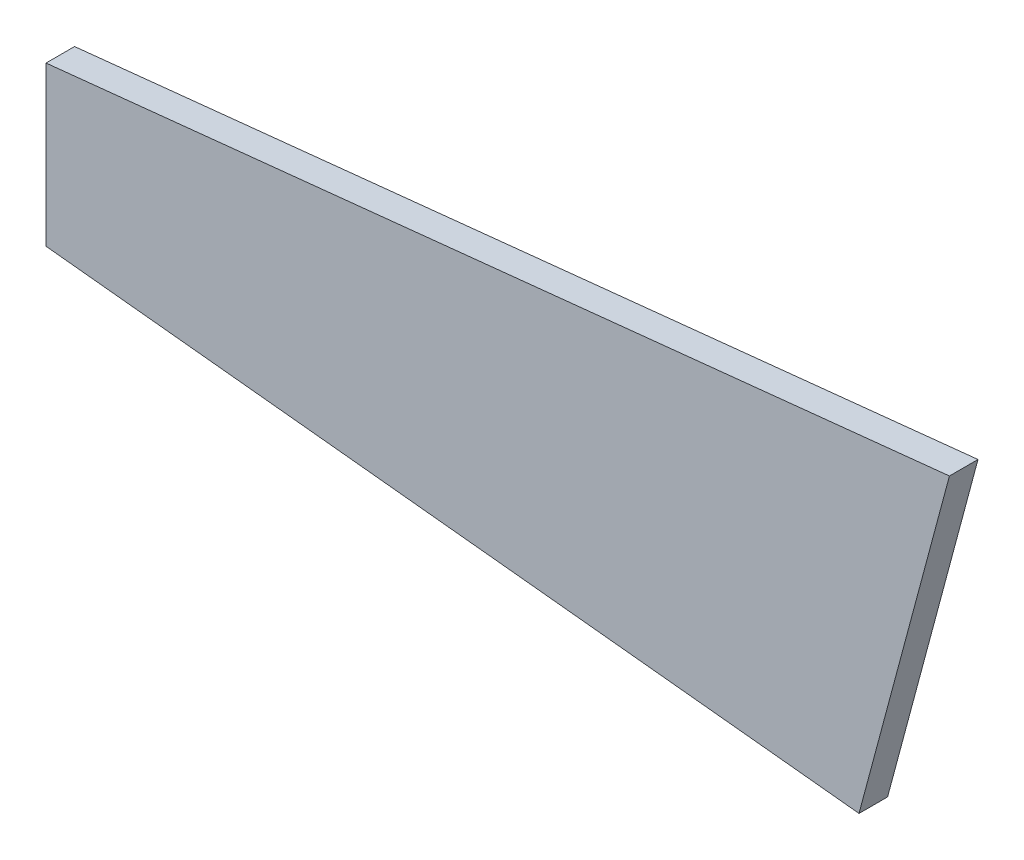
ISO-10303-21;
HEADER;
FILE_DESCRIPTION(('STEP AP214'),'2;1');
FILE_NAME('part.step','',(''),(''),'','','');
FILE_SCHEMA(('AUTOMOTIVE_DESIGN { 1 0 10303 214 1 1 1 1 }'));
ENDSEC;
DATA;
#1=APPLICATION_CONTEXT('core data for automotive mechanical design processes');
#2=APPLICATION_PROTOCOL_DEFINITION('international standard','automotive_design',2000,#1);
#3=PRODUCT_CONTEXT('',#1,'mechanical');
#4=PRODUCT('Part','Part','',(#3));
#5=PRODUCT_RELATED_PRODUCT_CATEGORY('part','',(#4));
#6=PRODUCT_DEFINITION_FORMATION('','',#4);
#7=PRODUCT_DEFINITION_CONTEXT('part definition',#1,'design');
#8=PRODUCT_DEFINITION('design','',#6,#7);
#9=PRODUCT_DEFINITION_SHAPE('','',#8);
#10=(LENGTH_UNIT() NAMED_UNIT(*) SI_UNIT(.MILLI.,.METRE.));
#11=(NAMED_UNIT(*) PLANE_ANGLE_UNIT() SI_UNIT($,.RADIAN.));
#12=(NAMED_UNIT(*) SI_UNIT($,.STERADIAN.) SOLID_ANGLE_UNIT());
#13=UNCERTAINTY_MEASURE_WITH_UNIT(LENGTH_MEASURE(1.E-05),#10,'distance_accuracy_value','');
#14=(GEOMETRIC_REPRESENTATION_CONTEXT(3) GLOBAL_UNCERTAINTY_ASSIGNED_CONTEXT((#13)) GLOBAL_UNIT_ASSIGNED_CONTEXT((#10,
#11,#12)) REPRESENTATION_CONTEXT('',''));
#15=CARTESIAN_POINT('',(0.,0.,0.));
#16=DIRECTION('',(0.,0.,1.));
#17=DIRECTION('',(1.,0.,0.));
#18=AXIS2_PLACEMENT_3D('',#15,#16,#17);
#19=CARTESIAN_POINT('',(140.,50.,-2.273736754432E-13));
#20=DIRECTION('',(0.103606084258982,-0.994618408890827,0.));
#21=DIRECTION('',(0.,0.,-1.));
#22=AXIS2_PLACEMENT_3D('',#19,#20,#21);
#23=PLANE('',#22);
#24=DIRECTION('',(0.,0.,1.));
#25=VECTOR('',#24,1.);
#26=CARTESIAN_POINT('',(-180.,16.666666666667,-2.273736754432E-13));
#27=LINE('',#26,#25);
#28=CARTESIAN_POINT('',(-180.,16.666666666667,-2.273736754432E-13));
#29=VERTEX_POINT('',#28);
#30=CARTESIAN_POINT('',(-180.,16.666666666667,6.));
#31=VERTEX_POINT('',#30);
#32=EDGE_CURVE('E11',#29,#31,#27,.T.);
#33=ORIENTED_EDGE('',*,*,#32,.T.);
#34=DIRECTION('',(-0.994618408890827,-0.103606084258982,0.));
#35=VECTOR('',#34,1.);
#36=CARTESIAN_POINT('',(140.,50.,6.));
#37=LINE('',#36,#35);
#38=CARTESIAN_POINT('',(9.762347773835,36.433577893108,6.));
#39=VERTEX_POINT('',#38);
#40=EDGE_CURVE('E21',#39,#31,#37,.T.);
#41=ORIENTED_EDGE('',*,*,#40,.F.);
#42=DIRECTION('',(0.,0.,-1.));
#43=VECTOR('',#42,1.);
#44=CARTESIAN_POINT('',(9.762347773835,36.433577893108,-917.5));
#45=LINE('',#44,#43);
#46=CARTESIAN_POINT('',(9.762347773835,36.433577893108,-2.273736754432E-13));
#47=VERTEX_POINT('',#46);
#48=EDGE_CURVE('E106',#39,#47,#45,.T.);
#49=ORIENTED_EDGE('',*,*,#48,.T.);
#50=DIRECTION('',(-0.994618408890827,-0.103606084258982,0.));
#51=VECTOR('',#50,1.);
#52=CARTESIAN_POINT('',(140.,50.,-2.273736754432E-13));
#53=LINE('',#52,#51);
#54=EDGE_CURVE('E76',#47,#29,#53,.T.);
#55=ORIENTED_EDGE('',*,*,#54,.T.);
#56=EDGE_LOOP('',(#33,#41,#49,#55));
#57=FACE_BOUND('',#56,.T.);
#58=ADVANCED_FACE('F17',(#57),#23,.F.);
#59=CARTESIAN_POINT('',(-180.,16.666666666667,-2.273736754432E-13));
#60=DIRECTION('',(1.,0.,0.));
#61=DIRECTION('',(0.,1.,0.));
#62=AXIS2_PLACEMENT_3D('',#59,#60,#61);
#63=PLANE('',#62);
#64=DIRECTION('',(0.,-1.,0.));
#65=VECTOR('',#64,1.);
#66=CARTESIAN_POINT('',(-180.,16.666666666667,-2.273736754432E-13));
#67=LINE('',#66,#65);
#68=CARTESIAN_POINT('',(-180.,-16.66666666666,-2.273736754432E-13));
#69=VERTEX_POINT('',#68);
#70=EDGE_CURVE('E81',#29,#69,#67,.T.);
#71=ORIENTED_EDGE('',*,*,#70,.T.);
#72=DIRECTION('',(0.,0.,1.));
#73=VECTOR('',#72,1.);
#74=CARTESIAN_POINT('',(-180.,-16.66666666666,-2.273736754432E-13));
#75=LINE('',#74,#73);
#76=CARTESIAN_POINT('',(-180.,-16.66666666666,6.));
#77=VERTEX_POINT('',#76);
#78=EDGE_CURVE('E89',#69,#77,#75,.T.);
#79=ORIENTED_EDGE('',*,*,#78,.T.);
#80=DIRECTION('',(0.,-1.,0.));
#81=VECTOR('',#80,1.);
#82=CARTESIAN_POINT('',(-180.,16.666666666667,6.));
#83=LINE('',#82,#81);
#84=EDGE_CURVE('E112',#31,#77,#83,.T.);
#85=ORIENTED_EDGE('',*,*,#84,.F.);
#86=ORIENTED_EDGE('',*,*,#32,.F.);
#87=EDGE_LOOP('',(#71,#79,#85,#86));
#88=FACE_BOUND('',#87,.T.);
#89=ADVANCED_FACE('F19',(#88),#63,.F.);
#90=CARTESIAN_POINT('',(-6.268384370371,2.273736754432E-13,6.));
#91=DIRECTION('',(0.,0.,1.));
#92=DIRECTION('',(0.,-1.,0.));
#93=AXIS2_PLACEMENT_3D('',#90,#91,#92);
#94=PLANE('',#93);
#95=ORIENTED_EDGE('',*,*,#84,.T.);
#96=DIRECTION('',(0.994618408890827,-0.103606084258982,0.));
#97=VECTOR('',#96,1.);
#98=CARTESIAN_POINT('',(-180.,-16.66666666666,6.));
#99=LINE('',#98,#97);
#100=CARTESIAN_POINT('',(-9.23218428166,-34.45498080399,6.));
#101=VERTEX_POINT('',#100);
#102=EDGE_CURVE('E96',#77,#101,#99,.T.);
#103=ORIENTED_EDGE('',*,*,#102,.T.);
#104=DIRECTION('',(-0.258819045102985,-0.965925826288944,0.));
#105=VECTOR('',#104,1.);
#106=CARTESIAN_POINT('',(-165.1611633462,-616.3898530453,6.));
#107=LINE('',#106,#105);
#108=EDGE_CURVE('E93',#39,#101,#107,.T.);
#109=ORIENTED_EDGE('',*,*,#108,.F.);
#110=ORIENTED_EDGE('',*,*,#40,.T.);
#111=EDGE_LOOP('',(#95,#103,#109,#110));
#112=FACE_BOUND('',#111,.T.);
#113=ADVANCED_FACE('F120',(#112),#94,.T.);
#114=CARTESIAN_POINT('',(-329.90242456,-1231.212609998,-1835.));
#115=DIRECTION('',(-0.965925826288944,0.258819045102985,0.));
#116=DIRECTION('',(0.,0.,1.));
#117=AXIS2_PLACEMENT_3D('',#114,#115,#116);
#118=PLANE('',#117);
#119=ORIENTED_EDGE('',*,*,#48,.F.);
#120=ORIENTED_EDGE('',*,*,#108,.T.);
#121=DIRECTION('',(0.,0.,1.));
#122=VECTOR('',#121,1.);
#123=CARTESIAN_POINT('',(-9.23218428166,-34.45498080399,-917.5));
#124=LINE('',#123,#122);
#125=CARTESIAN_POINT('',(-9.23218428166,-34.45498080399,-2.273736754432E-13));
#126=VERTEX_POINT('',#125);
#127=EDGE_CURVE('E87',#126,#101,#124,.T.);
#128=ORIENTED_EDGE('',*,*,#127,.F.);
#129=DIRECTION('',(-0.258819045102985,-0.965925826288944,0.));
#130=VECTOR('',#129,1.);
#131=CARTESIAN_POINT('',(-165.1611633462,-616.3898530453,0.));
#132=LINE('',#131,#130);
#133=EDGE_CURVE('E70',#47,#126,#132,.T.);
#134=ORIENTED_EDGE('',*,*,#133,.F.);
#135=EDGE_LOOP('',(#119,#120,#128,#134));
#136=FACE_BOUND('',#135,.T.);
#137=ADVANCED_FACE('F92',(#136),#118,.F.);
#138=CARTESIAN_POINT('',(-6.268384370371,2.273736754432E-13,-2.273736754432E-13));
#139=DIRECTION('',(0.,0.,1.));
#140=DIRECTION('',(0.,-1.,0.));
#141=AXIS2_PLACEMENT_3D('',#138,#139,#140);
#142=PLANE('',#141);
#143=ORIENTED_EDGE('',*,*,#54,.F.);
#144=ORIENTED_EDGE('',*,*,#133,.T.);
#145=DIRECTION('',(0.994618408890827,-0.103606084258982,0.));
#146=VECTOR('',#145,1.);
#147=CARTESIAN_POINT('',(-180.,-16.66666666666,-2.273736754432E-13));
#148=LINE('',#147,#146);
#149=EDGE_CURVE('E74',#69,#126,#148,.T.);
#150=ORIENTED_EDGE('',*,*,#149,.F.);
#151=ORIENTED_EDGE('',*,*,#70,.F.);
#152=EDGE_LOOP('',(#143,#144,#150,#151));
#153=FACE_BOUND('',#152,.T.);
#154=ADVANCED_FACE('F72',(#153),#142,.F.);
#155=CARTESIAN_POINT('',(-180.,-16.66666666666,-2.273736754432E-13));
#156=DIRECTION('',(0.103606084258982,0.994618408890827,0.));
#157=DIRECTION('',(0.,0.,-1.));
#158=AXIS2_PLACEMENT_3D('',#155,#156,#157);
#159=PLANE('',#158);
#160=ORIENTED_EDGE('',*,*,#127,.T.);
#161=ORIENTED_EDGE('',*,*,#102,.F.);
#162=ORIENTED_EDGE('',*,*,#78,.F.);
#163=ORIENTED_EDGE('',*,*,#149,.T.);
#164=EDGE_LOOP('',(#160,#161,#162,#163));
#165=FACE_BOUND('',#164,.T.);
#166=ADVANCED_FACE('F85',(#165),#159,.F.);
#167=CLOSED_SHELL('',(#58,#89,#113,#137,#154,#166));
#168=MANIFOLD_SOLID_BREP('B1',#167);
#169=ADVANCED_BREP_SHAPE_REPRESENTATION('',(#18,#168),#14);
#170=SHAPE_DEFINITION_REPRESENTATION(#9,#169);
ENDSEC;
END-ISO-10303-21;
